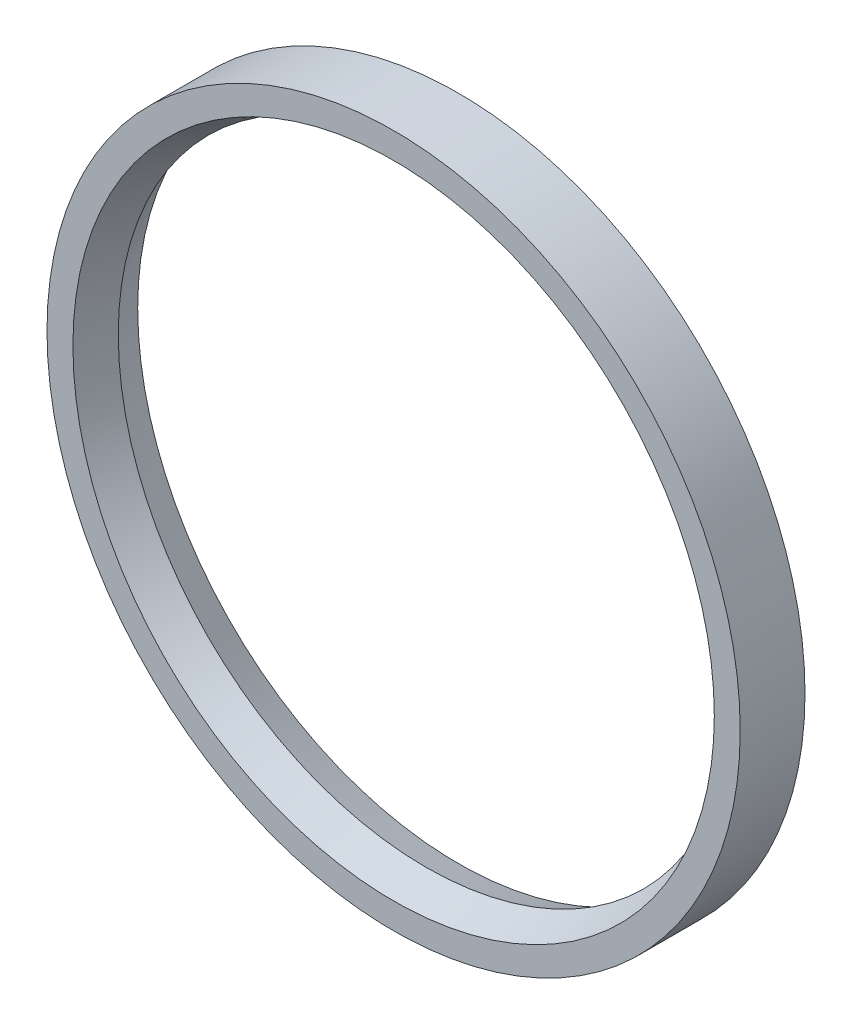
ISO-10303-21;
HEADER;
FILE_DESCRIPTION(('STEP AP214'),'2;1');
FILE_NAME('part.step','',(''),(''),'','','');
FILE_SCHEMA(('AUTOMOTIVE_DESIGN { 1 0 10303 214 1 1 1 1 }'));
ENDSEC;
DATA;
#1=APPLICATION_CONTEXT('core data for automotive mechanical design processes');
#2=APPLICATION_PROTOCOL_DEFINITION('international standard','automotive_design',2000,#1);
#3=PRODUCT_CONTEXT('',#1,'mechanical');
#4=PRODUCT('Part','Part','',(#3));
#5=PRODUCT_RELATED_PRODUCT_CATEGORY('part','',(#4));
#6=PRODUCT_DEFINITION_FORMATION('','',#4);
#7=PRODUCT_DEFINITION_CONTEXT('part definition',#1,'design');
#8=PRODUCT_DEFINITION('design','',#6,#7);
#9=PRODUCT_DEFINITION_SHAPE('','',#8);
#10=(LENGTH_UNIT() NAMED_UNIT(*) SI_UNIT(.MILLI.,.METRE.));
#11=(NAMED_UNIT(*) PLANE_ANGLE_UNIT() SI_UNIT($,.RADIAN.));
#12=(NAMED_UNIT(*) SI_UNIT($,.STERADIAN.) SOLID_ANGLE_UNIT());
#13=UNCERTAINTY_MEASURE_WITH_UNIT(LENGTH_MEASURE(1.E-05),#10,'distance_accuracy_value','');
#14=(GEOMETRIC_REPRESENTATION_CONTEXT(3) GLOBAL_UNCERTAINTY_ASSIGNED_CONTEXT((#13)) GLOBAL_UNIT_ASSIGNED_CONTEXT((#10,
#11,#12)) REPRESENTATION_CONTEXT('',''));
#15=CARTESIAN_POINT('',(0.,0.,0.));
#16=DIRECTION('',(0.,0.,1.));
#17=DIRECTION('',(1.,0.,0.));
#18=AXIS2_PLACEMENT_3D('',#15,#16,#17);
#19=CARTESIAN_POINT('',(0.,2.,0.));
#20=DIRECTION('',(0.,0.,-1.));
#21=DIRECTION('',(-1.,0.,0.));
#22=AXIS2_PLACEMENT_3D('',#19,#20,#21);
#23=PLANE('',#22);
#24=CARTESIAN_POINT('',(0.,-24.75,0.));
#25=DIRECTION('',(0.,0.,1.));
#26=DIRECTION('',(1.,0.,0.));
#27=AXIS2_PLACEMENT_3D('',#24,#25,#26);
#28=CIRCLE('',#27,24.75);
#29=CARTESIAN_POINT('',(24.75,-24.75,0.));
#30=VERTEX_POINT('',#29);
#31=EDGE_CURVE('E60',#30,#30,#28,.T.);
#32=ORIENTED_EDGE('',*,*,#31,.F.);
#33=EDGE_LOOP('',(#32));
#34=FACE_BOUND('',#33,.T.);
#35=CARTESIAN_POINT('',(0.,-24.75,0.));
#36=DIRECTION('',(0.,0.,1.));
#37=DIRECTION('',(1.,0.,0.));
#38=AXIS2_PLACEMENT_3D('',#35,#36,#37);
#39=CIRCLE('',#38,26.75);
#40=CARTESIAN_POINT('',(26.75,-24.75,0.));
#41=VERTEX_POINT('',#40);
#42=EDGE_CURVE('E10',#41,#41,#39,.T.);
#43=ORIENTED_EDGE('',*,*,#42,.T.);
#44=EDGE_LOOP('',(#43));
#45=FACE_BOUND('',#44,.T.);
#46=ADVANCED_FACE('F37',(#34,#45),#23,.F.);
#47=CARTESIAN_POINT('',(0.,-24.75,0.));
#48=DIRECTION('',(0.,0.,1.));
#49=DIRECTION('',(1.,0.,0.));
#50=AXIS2_PLACEMENT_3D('',#47,#48,#49);
#51=CYLINDRICAL_SURFACE('',#50,26.75);
#52=ORIENTED_EDGE('',*,*,#42,.F.);
#53=EDGE_LOOP('',(#52));
#54=FACE_BOUND('',#53,.T.);
#55=CARTESIAN_POINT('',(0.,-24.75,-5.));
#56=DIRECTION('',(0.,0.,1.));
#57=DIRECTION('',(1.,0.,0.));
#58=AXIS2_PLACEMENT_3D('',#55,#56,#57);
#59=CIRCLE('',#58,26.75);
#60=CARTESIAN_POINT('',(26.75,-24.75,-5.));
#61=VERTEX_POINT('',#60);
#62=EDGE_CURVE('E44',#61,#61,#59,.T.);
#63=ORIENTED_EDGE('',*,*,#62,.T.);
#64=EDGE_LOOP('',(#63));
#65=FACE_BOUND('',#64,.T.);
#66=ADVANCED_FACE('F68',(#54,#65),#51,.T.);
#67=CARTESIAN_POINT('',(0.,0.,-5.));
#68=DIRECTION('',(0.,0.,1.));
#69=DIRECTION('',(1.,0.,0.));
#70=AXIS2_PLACEMENT_3D('',#67,#68,#69);
#71=PLANE('',#70);
#72=ORIENTED_EDGE('',*,*,#62,.F.);
#73=EDGE_LOOP('',(#72));
#74=FACE_BOUND('',#73,.T.);
#75=CARTESIAN_POINT('',(0.,-24.75,-5.));
#76=DIRECTION('',(0.,0.,1.));
#77=DIRECTION('',(1.,0.,0.));
#78=AXIS2_PLACEMENT_3D('',#75,#76,#77);
#79=CIRCLE('',#78,24.75);
#80=CARTESIAN_POINT('',(24.75,-24.75,-5.));
#81=VERTEX_POINT('',#80);
#82=EDGE_CURVE('E49',#81,#81,#79,.T.);
#83=ORIENTED_EDGE('',*,*,#82,.T.);
#84=EDGE_LOOP('',(#83));
#85=FACE_BOUND('',#84,.T.);
#86=ADVANCED_FACE('F72',(#74,#85),#71,.F.);
#87=CARTESIAN_POINT('',(0.,-24.75,-2.5));
#88=DIRECTION('',(0.,0.,-1.));
#89=DIRECTION('',(-1.,0.,0.));
#90=AXIS2_PLACEMENT_3D('',#87,#88,#89);
#91=CONICAL_SURFACE('',#90,23.75,0.380506377112365);
#92=ORIENTED_EDGE('',*,*,#82,.F.);
#93=EDGE_LOOP('',(#92));
#94=FACE_BOUND('',#93,.T.);
#95=CARTESIAN_POINT('',(0.,-24.75,-2.5));
#96=DIRECTION('',(0.,0.,1.));
#97=DIRECTION('',(1.,0.,0.));
#98=AXIS2_PLACEMENT_3D('',#95,#96,#97);
#99=CIRCLE('',#98,23.75);
#100=CARTESIAN_POINT('',(23.75,-24.75,-2.5));
#101=VERTEX_POINT('',#100);
#102=EDGE_CURVE('E54',#101,#101,#99,.T.);
#103=ORIENTED_EDGE('',*,*,#102,.T.);
#104=EDGE_LOOP('',(#103));
#105=FACE_BOUND('',#104,.T.);
#106=ADVANCED_FACE('F77',(#94,#105),#91,.F.);
#107=CARTESIAN_POINT('',(0.,-24.75,0.));
#108=DIRECTION('',(0.,0.,1.));
#109=DIRECTION('',(1.,0.,0.));
#110=AXIS2_PLACEMENT_3D('',#107,#108,#109);
#111=CONICAL_SURFACE('',#110,24.75,0.380506377112365);
#112=ORIENTED_EDGE('',*,*,#102,.F.);
#113=EDGE_LOOP('',(#112));
#114=FACE_BOUND('',#113,.T.);
#115=ORIENTED_EDGE('',*,*,#31,.T.);
#116=EDGE_LOOP('',(#115));
#117=FACE_BOUND('',#116,.T.);
#118=ADVANCED_FACE('F65',(#114,#117),#111,.F.);
#119=CLOSED_SHELL('',(#46,#66,#86,#106,#118));
#120=MANIFOLD_SOLID_BREP('B2',#119);
#121=ADVANCED_BREP_SHAPE_REPRESENTATION('',(#18,#120),#14);
#122=SHAPE_DEFINITION_REPRESENTATION(#9,#121);
ENDSEC;
END-ISO-10303-21;
